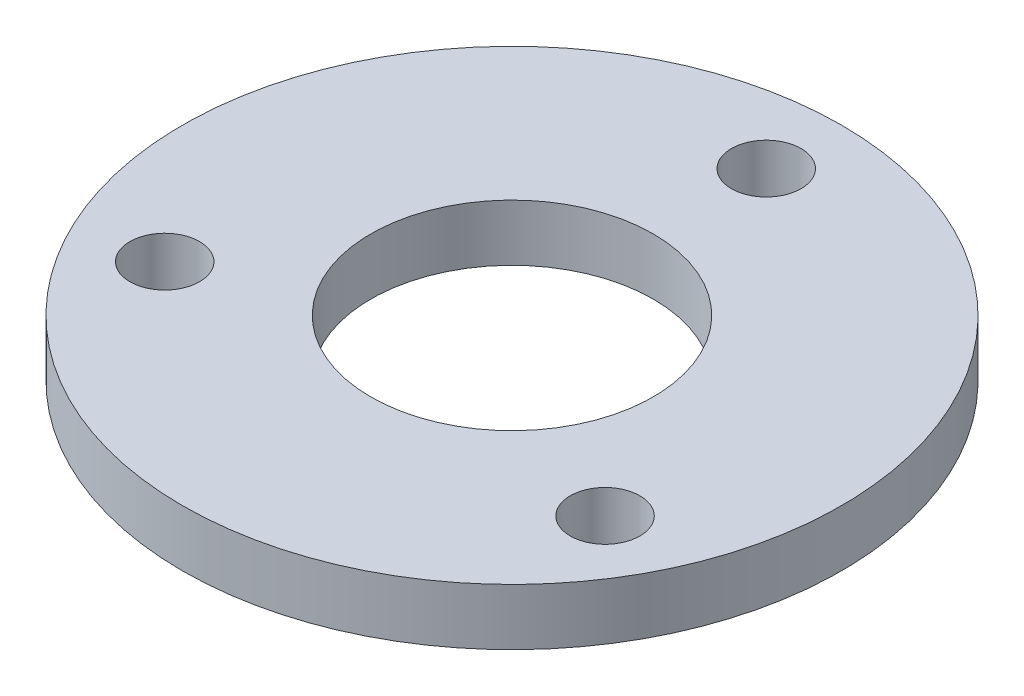
ISO-10303-21;
HEADER;
FILE_DESCRIPTION(('STEP AP214'),'2;1');
FILE_NAME('part.step','',(''),(''),'','','');
FILE_SCHEMA(('AUTOMOTIVE_DESIGN { 1 0 10303 214 1 1 1 1 }'));
ENDSEC;
DATA;
#1=APPLICATION_CONTEXT('core data for automotive mechanical design processes');
#2=APPLICATION_PROTOCOL_DEFINITION('international standard','automotive_design',2000,#1);
#3=PRODUCT_CONTEXT('',#1,'mechanical');
#4=PRODUCT('Part','Part','',(#3));
#5=PRODUCT_RELATED_PRODUCT_CATEGORY('part','',(#4));
#6=PRODUCT_DEFINITION_FORMATION('','',#4);
#7=PRODUCT_DEFINITION_CONTEXT('part definition',#1,'design');
#8=PRODUCT_DEFINITION('design','',#6,#7);
#9=PRODUCT_DEFINITION_SHAPE('','',#8);
#10=(LENGTH_UNIT() NAMED_UNIT(*) SI_UNIT(.MILLI.,.METRE.));
#11=(NAMED_UNIT(*) PLANE_ANGLE_UNIT() SI_UNIT($,.RADIAN.));
#12=(NAMED_UNIT(*) SI_UNIT($,.STERADIAN.) SOLID_ANGLE_UNIT());
#13=UNCERTAINTY_MEASURE_WITH_UNIT(LENGTH_MEASURE(1.E-05),#10,'distance_accuracy_value','');
#14=(GEOMETRIC_REPRESENTATION_CONTEXT(3) GLOBAL_UNCERTAINTY_ASSIGNED_CONTEXT((#13)) GLOBAL_UNIT_ASSIGNED_CONTEXT((#10,
#11,#12)) REPRESENTATION_CONTEXT('',''));
#15=CARTESIAN_POINT('',(0.,0.,0.));
#16=DIRECTION('',(0.,0.,1.));
#17=DIRECTION('',(1.,0.,0.));
#18=AXIS2_PLACEMENT_3D('',#15,#16,#17);
#19=CARTESIAN_POINT('',(0.,3.,0.));
#20=DIRECTION('',(0.,1.,0.));
#21=DIRECTION('',(0.,0.,1.));
#22=AXIS2_PLACEMENT_3D('',#19,#20,#21);
#23=PLANE('',#22);
#24=CARTESIAN_POINT('',(-11.6913429510899,3.,6.75000000000001));
#25=DIRECTION('',(0.,1.,0.));
#26=DIRECTION('',(0.,0.,1.));
#27=AXIS2_PLACEMENT_3D('',#24,#25,#26);
#28=CIRCLE('',#27,1.85);
#29=CARTESIAN_POINT('',(-11.6913429510899,3.,8.6));
#30=VERTEX_POINT('',#29);
#31=EDGE_CURVE('E64',#30,#30,#28,.T.);
#32=ORIENTED_EDGE('',*,*,#31,.F.);
#33=EDGE_LOOP('',(#32));
#34=FACE_BOUND('',#33,.T.);
#35=CARTESIAN_POINT('',(0.,3.,-13.5));
#36=DIRECTION('',(0.,1.,0.));
#37=DIRECTION('',(0.,0.,1.));
#38=AXIS2_PLACEMENT_3D('',#35,#36,#37);
#39=CIRCLE('',#38,1.85);
#40=CARTESIAN_POINT('',(0.,3.,-11.65));
#41=VERTEX_POINT('',#40);
#42=EDGE_CURVE('E50',#41,#41,#39,.T.);
#43=ORIENTED_EDGE('',*,*,#42,.F.);
#44=EDGE_LOOP('',(#43));
#45=FACE_BOUND('',#44,.T.);
#46=CARTESIAN_POINT('',(0.,3.,0.));
#47=DIRECTION('',(0.,1.,0.));
#48=DIRECTION('',(0.,0.,1.));
#49=AXIS2_PLACEMENT_3D('',#46,#47,#48);
#50=CIRCLE('',#49,17.5);
#51=CARTESIAN_POINT('',(0.,3.,17.5));
#52=VERTEX_POINT('',#51);
#53=EDGE_CURVE('E10',#52,#52,#50,.T.);
#54=ORIENTED_EDGE('',*,*,#53,.T.);
#55=EDGE_LOOP('',(#54));
#56=FACE_BOUND('',#55,.T.);
#57=CARTESIAN_POINT('',(11.6913429510899,3.,6.75));
#58=DIRECTION('',(0.,1.,0.));
#59=DIRECTION('',(0.,0.,1.));
#60=AXIS2_PLACEMENT_3D('',#57,#58,#59);
#61=CIRCLE('',#60,1.85);
#62=CARTESIAN_POINT('',(11.6913429510899,3.,8.6));
#63=VERTEX_POINT('',#62);
#64=EDGE_CURVE('E56',#63,#63,#61,.T.);
#65=ORIENTED_EDGE('',*,*,#64,.F.);
#66=EDGE_LOOP('',(#65));
#67=FACE_BOUND('',#66,.T.);
#68=CARTESIAN_POINT('',(0.,3.,0.));
#69=DIRECTION('',(0.,1.,0.));
#70=DIRECTION('',(0.,0.,1.));
#71=AXIS2_PLACEMENT_3D('',#68,#69,#70);
#72=CIRCLE('',#71,7.5);
#73=CARTESIAN_POINT('',(0.,3.,7.5));
#74=VERTEX_POINT('',#73);
#75=EDGE_CURVE('E72',#74,#74,#72,.T.);
#76=ORIENTED_EDGE('',*,*,#75,.F.);
#77=EDGE_LOOP('',(#76));
#78=FACE_BOUND('',#77,.T.);
#79=ADVANCED_FACE('F37',(#34,#45,#56,#67,#78),#23,.T.);
#80=CARTESIAN_POINT('',(0.,0.,0.));
#81=DIRECTION('',(0.,1.,0.));
#82=DIRECTION('',(0.,0.,1.));
#83=AXIS2_PLACEMENT_3D('',#80,#81,#82);
#84=PLANE('',#83);
#85=CARTESIAN_POINT('',(0.,0.,0.));
#86=DIRECTION('',(0.,1.,0.));
#87=DIRECTION('',(0.,0.,1.));
#88=AXIS2_PLACEMENT_3D('',#85,#86,#87);
#89=CIRCLE('',#88,17.5);
#90=CARTESIAN_POINT('',(0.,0.,17.5));
#91=VERTEX_POINT('',#90);
#92=EDGE_CURVE('E41',#91,#91,#89,.T.);
#93=ORIENTED_EDGE('',*,*,#92,.F.);
#94=EDGE_LOOP('',(#93));
#95=FACE_BOUND('',#94,.T.);
#96=CARTESIAN_POINT('',(0.,0.,-13.5));
#97=DIRECTION('',(0.,1.,0.));
#98=DIRECTION('',(0.,0.,1.));
#99=AXIS2_PLACEMENT_3D('',#96,#97,#98);
#100=CIRCLE('',#99,1.85);
#101=CARTESIAN_POINT('',(0.,0.,-11.65));
#102=VERTEX_POINT('',#101);
#103=EDGE_CURVE('E52',#102,#102,#100,.T.);
#104=ORIENTED_EDGE('',*,*,#103,.T.);
#105=EDGE_LOOP('',(#104));
#106=FACE_BOUND('',#105,.T.);
#107=CARTESIAN_POINT('',(11.6913429510899,0.,6.75));
#108=DIRECTION('',(0.,1.,0.));
#109=DIRECTION('',(0.,0.,1.));
#110=AXIS2_PLACEMENT_3D('',#107,#108,#109);
#111=CIRCLE('',#110,1.85);
#112=CARTESIAN_POINT('',(11.6913429510899,0.,8.6));
#113=VERTEX_POINT('',#112);
#114=EDGE_CURVE('E60',#113,#113,#111,.T.);
#115=ORIENTED_EDGE('',*,*,#114,.T.);
#116=EDGE_LOOP('',(#115));
#117=FACE_BOUND('',#116,.T.);
#118=CARTESIAN_POINT('',(-11.6913429510899,0.,6.75000000000001));
#119=DIRECTION('',(0.,1.,0.));
#120=DIRECTION('',(0.,0.,1.));
#121=AXIS2_PLACEMENT_3D('',#118,#119,#120);
#122=CIRCLE('',#121,1.85);
#123=CARTESIAN_POINT('',(-11.6913429510899,0.,8.6));
#124=VERTEX_POINT('',#123);
#125=EDGE_CURVE('E68',#124,#124,#122,.T.);
#126=ORIENTED_EDGE('',*,*,#125,.T.);
#127=EDGE_LOOP('',(#126));
#128=FACE_BOUND('',#127,.T.);
#129=CARTESIAN_POINT('',(0.,0.,0.));
#130=DIRECTION('',(0.,1.,0.));
#131=DIRECTION('',(0.,0.,1.));
#132=AXIS2_PLACEMENT_3D('',#129,#130,#131);
#133=CIRCLE('',#132,7.5);
#134=CARTESIAN_POINT('',(0.,0.,7.5));
#135=VERTEX_POINT('',#134);
#136=EDGE_CURVE('E76',#135,#135,#133,.T.);
#137=ORIENTED_EDGE('',*,*,#136,.T.);
#138=EDGE_LOOP('',(#137));
#139=FACE_BOUND('',#138,.T.);
#140=ADVANCED_FACE('F88',(#95,#106,#117,#128,#139),#84,.F.);
#141=CARTESIAN_POINT('',(0.,3.,0.));
#142=DIRECTION('',(0.,-1.,0.));
#143=DIRECTION('',(0.,0.,-1.));
#144=AXIS2_PLACEMENT_3D('',#141,#142,#143);
#145=CYLINDRICAL_SURFACE('',#144,17.5);
#146=ORIENTED_EDGE('',*,*,#53,.F.);
#147=EDGE_LOOP('',(#146));
#148=FACE_BOUND('',#147,.T.);
#149=ORIENTED_EDGE('',*,*,#92,.T.);
#150=EDGE_LOOP('',(#149));
#151=FACE_BOUND('',#150,.T.);
#152=ADVANCED_FACE('F39',(#148,#151),#145,.T.);
#153=CARTESIAN_POINT('',(0.,3.,-13.5));
#154=DIRECTION('',(0.,-1.,0.));
#155=DIRECTION('',(0.,0.,-1.));
#156=AXIS2_PLACEMENT_3D('',#153,#154,#155);
#157=CYLINDRICAL_SURFACE('',#156,1.85);
#158=ORIENTED_EDGE('',*,*,#42,.T.);
#159=EDGE_LOOP('',(#158));
#160=FACE_BOUND('',#159,.T.);
#161=ORIENTED_EDGE('',*,*,#103,.F.);
#162=EDGE_LOOP('',(#161));
#163=FACE_BOUND('',#162,.T.);
#164=ADVANCED_FACE('F98',(#160,#163),#157,.F.);
#165=CARTESIAN_POINT('',(11.6913429510899,3.,6.75));
#166=DIRECTION('',(0.,-1.,0.));
#167=DIRECTION('',(0.,0.,-1.));
#168=AXIS2_PLACEMENT_3D('',#165,#166,#167);
#169=CYLINDRICAL_SURFACE('',#168,1.85);
#170=ORIENTED_EDGE('',*,*,#64,.T.);
#171=EDGE_LOOP('',(#170));
#172=FACE_BOUND('',#171,.T.);
#173=ORIENTED_EDGE('',*,*,#114,.F.);
#174=EDGE_LOOP('',(#173));
#175=FACE_BOUND('',#174,.T.);
#176=ADVANCED_FACE('F101',(#172,#175),#169,.F.);
#177=CARTESIAN_POINT('',(-11.6913429510899,3.,6.75000000000001));
#178=DIRECTION('',(0.,-1.,0.));
#179=DIRECTION('',(0.,0.,-1.));
#180=AXIS2_PLACEMENT_3D('',#177,#178,#179);
#181=CYLINDRICAL_SURFACE('',#180,1.85);
#182=ORIENTED_EDGE('',*,*,#31,.T.);
#183=EDGE_LOOP('',(#182));
#184=FACE_BOUND('',#183,.T.);
#185=ORIENTED_EDGE('',*,*,#125,.F.);
#186=EDGE_LOOP('',(#185));
#187=FACE_BOUND('',#186,.T.);
#188=ADVANCED_FACE('F105',(#184,#187),#181,.F.);
#189=CARTESIAN_POINT('',(0.,3.,0.));
#190=DIRECTION('',(0.,-1.,0.));
#191=DIRECTION('',(0.,0.,-1.));
#192=AXIS2_PLACEMENT_3D('',#189,#190,#191);
#193=CYLINDRICAL_SURFACE('',#192,7.5);
#194=ORIENTED_EDGE('',*,*,#75,.T.);
#195=EDGE_LOOP('',(#194));
#196=FACE_BOUND('',#195,.T.);
#197=ORIENTED_EDGE('',*,*,#136,.F.);
#198=EDGE_LOOP('',(#197));
#199=FACE_BOUND('',#198,.T.);
#200=ADVANCED_FACE('F84',(#196,#199),#193,.F.);
#201=CLOSED_SHELL('',(#79,#140,#152,#164,#176,#188,#200));
#202=MANIFOLD_SOLID_BREP('B2',#201);
#203=ADVANCED_BREP_SHAPE_REPRESENTATION('',(#18,#202),#14);
#204=SHAPE_DEFINITION_REPRESENTATION(#9,#203);
ENDSEC;
END-ISO-10303-21;
